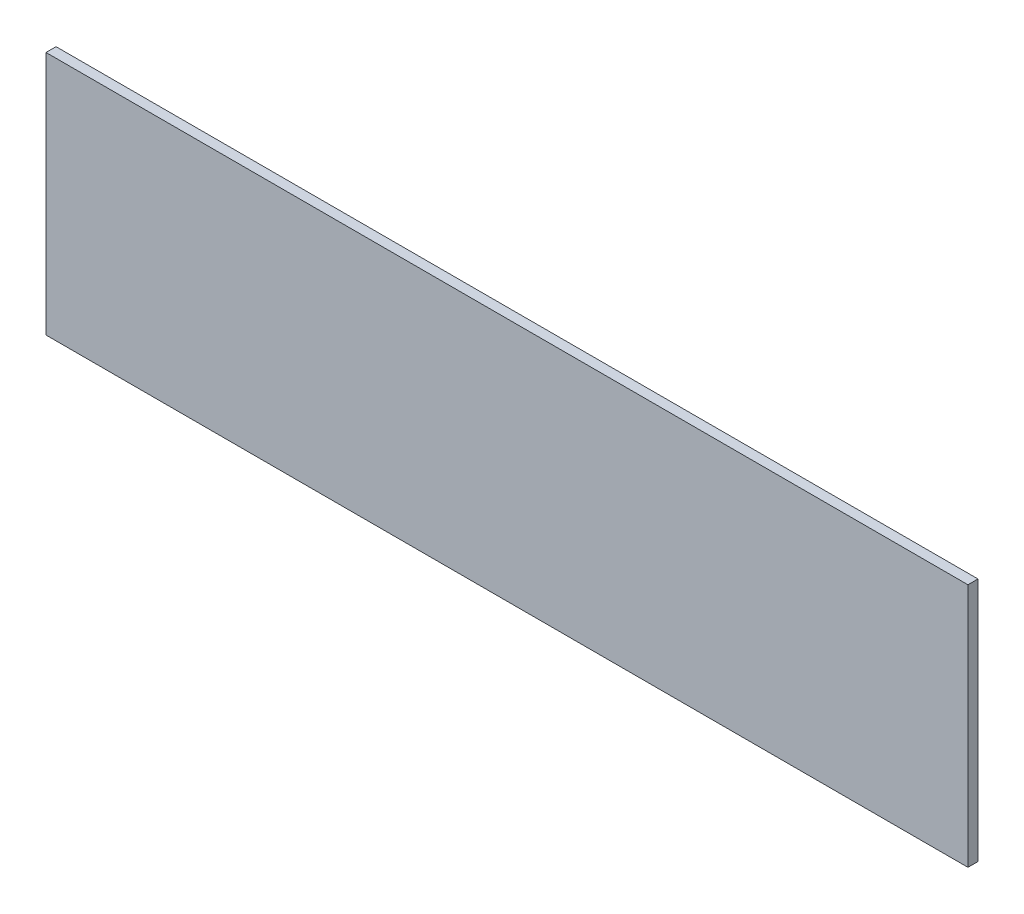
ISO-10303-21;
HEADER;
FILE_DESCRIPTION(('STEP AP214'),'2;1');
FILE_NAME('part.step','',(''),(''),'','','');
FILE_SCHEMA(('AUTOMOTIVE_DESIGN { 1 0 10303 214 1 1 1 1 }'));
ENDSEC;
DATA;
#1=APPLICATION_CONTEXT('core data for automotive mechanical design processes');
#2=APPLICATION_PROTOCOL_DEFINITION('international standard','automotive_design',2000,#1);
#3=PRODUCT_CONTEXT('',#1,'mechanical');
#4=PRODUCT('Part','Part','',(#3));
#5=PRODUCT_RELATED_PRODUCT_CATEGORY('part','',(#4));
#6=PRODUCT_DEFINITION_FORMATION('','',#4);
#7=PRODUCT_DEFINITION_CONTEXT('part definition',#1,'design');
#8=PRODUCT_DEFINITION('design','',#6,#7);
#9=PRODUCT_DEFINITION_SHAPE('','',#8);
#10=(LENGTH_UNIT() NAMED_UNIT(*) SI_UNIT(.MILLI.,.METRE.));
#11=(NAMED_UNIT(*) PLANE_ANGLE_UNIT() SI_UNIT($,.RADIAN.));
#12=(NAMED_UNIT(*) SI_UNIT($,.STERADIAN.) SOLID_ANGLE_UNIT());
#13=UNCERTAINTY_MEASURE_WITH_UNIT(LENGTH_MEASURE(1.E-05),#10,'distance_accuracy_value','');
#14=(GEOMETRIC_REPRESENTATION_CONTEXT(3) GLOBAL_UNCERTAINTY_ASSIGNED_CONTEXT((#13)) GLOBAL_UNIT_ASSIGNED_CONTEXT((#10,
#11,#12)) REPRESENTATION_CONTEXT('',''));
#15=CARTESIAN_POINT('',(0.,0.,0.));
#16=DIRECTION('',(0.,0.,1.));
#17=DIRECTION('',(1.,0.,0.));
#18=AXIS2_PLACEMENT_3D('',#15,#16,#17);
#19=CARTESIAN_POINT('',(137.5,36.5,3.));
#20=DIRECTION('',(-1.,0.,0.));
#21=DIRECTION('',(0.,-1.,0.));
#22=AXIS2_PLACEMENT_3D('',#19,#20,#21);
#23=PLANE('',#22);
#24=DIRECTION('',(0.,1.,0.));
#25=VECTOR('',#24,1.);
#26=CARTESIAN_POINT('',(137.5,36.5,0.));
#27=LINE('',#26,#25);
#28=CARTESIAN_POINT('',(137.5,-36.5,0.));
#29=VERTEX_POINT('',#28);
#30=CARTESIAN_POINT('',(137.5,36.5,0.));
#31=VERTEX_POINT('',#30);
#32=EDGE_CURVE('E104',#29,#31,#27,.T.);
#33=ORIENTED_EDGE('',*,*,#32,.T.);
#34=DIRECTION('',(0.,0.,-1.));
#35=VECTOR('',#34,1.);
#36=CARTESIAN_POINT('',(137.5,36.5,3.));
#37=LINE('',#36,#35);
#38=CARTESIAN_POINT('',(137.5,36.5,3.));
#39=VERTEX_POINT('',#38);
#40=EDGE_CURVE('E11',#39,#31,#37,.T.);
#41=ORIENTED_EDGE('',*,*,#40,.F.);
#42=DIRECTION('',(0.,1.,0.));
#43=VECTOR('',#42,1.);
#44=CARTESIAN_POINT('',(137.5,36.5,3.));
#45=LINE('',#44,#43);
#46=CARTESIAN_POINT('',(137.5,-36.5,3.));
#47=VERTEX_POINT('',#46);
#48=EDGE_CURVE('E92',#47,#39,#45,.T.);
#49=ORIENTED_EDGE('',*,*,#48,.F.);
#50=DIRECTION('',(0.,0.,-1.));
#51=VECTOR('',#50,1.);
#52=CARTESIAN_POINT('',(137.5,-36.5,3.));
#53=LINE('',#52,#51);
#54=EDGE_CURVE('E100',#47,#29,#53,.T.);
#55=ORIENTED_EDGE('',*,*,#54,.T.);
#56=EDGE_LOOP('',(#33,#41,#49,#55));
#57=FACE_BOUND('',#56,.T.);
#58=ADVANCED_FACE('F41',(#57),#23,.F.);
#59=CARTESIAN_POINT('',(-137.5,36.5,3.));
#60=DIRECTION('',(0.,-1.,0.));
#61=DIRECTION('',(0.,0.,-1.));
#62=AXIS2_PLACEMENT_3D('',#59,#60,#61);
#63=PLANE('',#62);
#64=DIRECTION('',(-1.,0.,0.));
#65=VECTOR('',#64,1.);
#66=CARTESIAN_POINT('',(-137.5,36.5,0.));
#67=LINE('',#66,#65);
#68=CARTESIAN_POINT('',(-137.5,36.5,0.));
#69=VERTEX_POINT('',#68);
#70=EDGE_CURVE('E96',#31,#69,#67,.T.);
#71=ORIENTED_EDGE('',*,*,#70,.T.);
#72=DIRECTION('',(0.,0.,-1.));
#73=VECTOR('',#72,1.);
#74=CARTESIAN_POINT('',(-137.5,36.5,3.));
#75=LINE('',#74,#73);
#76=CARTESIAN_POINT('',(-137.5,36.5,3.));
#77=VERTEX_POINT('',#76);
#78=EDGE_CURVE('E49',#77,#69,#75,.T.);
#79=ORIENTED_EDGE('',*,*,#78,.F.);
#80=DIRECTION('',(-1.,0.,0.));
#81=VECTOR('',#80,1.);
#82=CARTESIAN_POINT('',(-137.5,36.5,3.));
#83=LINE('',#82,#81);
#84=EDGE_CURVE('E87',#39,#77,#83,.T.);
#85=ORIENTED_EDGE('',*,*,#84,.F.);
#86=ORIENTED_EDGE('',*,*,#40,.T.);
#87=EDGE_LOOP('',(#71,#79,#85,#86));
#88=FACE_BOUND('',#87,.T.);
#89=ADVANCED_FACE('F95',(#88),#63,.F.);
#90=CARTESIAN_POINT('',(-137.5,36.5,3.));
#91=DIRECTION('',(1.,0.,0.));
#92=DIRECTION('',(0.,1.,0.));
#93=AXIS2_PLACEMENT_3D('',#90,#91,#92);
#94=PLANE('',#93);
#95=DIRECTION('',(0.,-1.,0.));
#96=VECTOR('',#95,1.);
#97=CARTESIAN_POINT('',(-137.5,36.5,0.));
#98=LINE('',#97,#96);
#99=CARTESIAN_POINT('',(-137.5,-36.5,0.));
#100=VERTEX_POINT('',#99);
#101=EDGE_CURVE('E74',#69,#100,#98,.T.);
#102=ORIENTED_EDGE('',*,*,#101,.T.);
#103=DIRECTION('',(0.,0.,-1.));
#104=VECTOR('',#103,1.);
#105=CARTESIAN_POINT('',(-137.5,-36.5,3.));
#106=LINE('',#105,#104);
#107=CARTESIAN_POINT('',(-137.5,-36.5,3.));
#108=VERTEX_POINT('',#107);
#109=EDGE_CURVE('E97',#108,#100,#106,.T.);
#110=ORIENTED_EDGE('',*,*,#109,.F.);
#111=DIRECTION('',(0.,-1.,0.));
#112=VECTOR('',#111,1.);
#113=CARTESIAN_POINT('',(-137.5,36.5,3.));
#114=LINE('',#113,#112);
#115=EDGE_CURVE('E90',#77,#108,#114,.T.);
#116=ORIENTED_EDGE('',*,*,#115,.F.);
#117=ORIENTED_EDGE('',*,*,#78,.T.);
#118=EDGE_LOOP('',(#102,#110,#116,#117));
#119=FACE_BOUND('',#118,.T.);
#120=ADVANCED_FACE('F98',(#119),#94,.F.);
#121=CARTESIAN_POINT('',(-137.5,-36.5,3.));
#122=DIRECTION('',(0.,1.,0.));
#123=DIRECTION('',(0.,0.,1.));
#124=AXIS2_PLACEMENT_3D('',#121,#122,#123);
#125=PLANE('',#124);
#126=DIRECTION('',(1.,0.,0.));
#127=VECTOR('',#126,1.);
#128=CARTESIAN_POINT('',(-137.5,-36.5,0.));
#129=LINE('',#128,#127);
#130=EDGE_CURVE('E80',#100,#29,#129,.T.);
#131=ORIENTED_EDGE('',*,*,#130,.T.);
#132=ORIENTED_EDGE('',*,*,#54,.F.);
#133=DIRECTION('',(1.,0.,0.));
#134=VECTOR('',#133,1.);
#135=CARTESIAN_POINT('',(-137.5,-36.5,3.));
#136=LINE('',#135,#134);
#137=EDGE_CURVE('E57',#108,#47,#136,.T.);
#138=ORIENTED_EDGE('',*,*,#137,.F.);
#139=ORIENTED_EDGE('',*,*,#109,.T.);
#140=EDGE_LOOP('',(#131,#132,#138,#139));
#141=FACE_BOUND('',#140,.T.);
#142=ADVANCED_FACE('F111',(#141),#125,.F.);
#143=CARTESIAN_POINT('',(0.,0.,3.));
#144=DIRECTION('',(0.,0.,1.));
#145=DIRECTION('',(1.,0.,0.));
#146=AXIS2_PLACEMENT_3D('',#143,#144,#145);
#147=PLANE('',#146);
#148=ORIENTED_EDGE('',*,*,#48,.T.);
#149=ORIENTED_EDGE('',*,*,#84,.T.);
#150=ORIENTED_EDGE('',*,*,#115,.T.);
#151=ORIENTED_EDGE('',*,*,#137,.T.);
#152=EDGE_LOOP('',(#148,#149,#150,#151));
#153=FACE_BOUND('',#152,.T.);
#154=ADVANCED_FACE('F88',(#153),#147,.T.);
#155=CARTESIAN_POINT('',(0.,0.,0.));
#156=DIRECTION('',(0.,0.,1.));
#157=DIRECTION('',(1.,0.,0.));
#158=AXIS2_PLACEMENT_3D('',#155,#156,#157);
#159=PLANE('',#158);
#160=ORIENTED_EDGE('',*,*,#32,.F.);
#161=ORIENTED_EDGE('',*,*,#130,.F.);
#162=ORIENTED_EDGE('',*,*,#101,.F.);
#163=ORIENTED_EDGE('',*,*,#70,.F.);
#164=EDGE_LOOP('',(#160,#161,#162,#163));
#165=FACE_BOUND('',#164,.T.);
#166=ADVANCED_FACE('F114',(#165),#159,.F.);
#167=CLOSED_SHELL('',(#58,#89,#120,#142,#154,#166));
#168=MANIFOLD_SOLID_BREP('B2',#167);
#169=ADVANCED_BREP_SHAPE_REPRESENTATION('',(#18,#168),#14);
#170=SHAPE_DEFINITION_REPRESENTATION(#9,#169);
ENDSEC;
END-ISO-10303-21;
